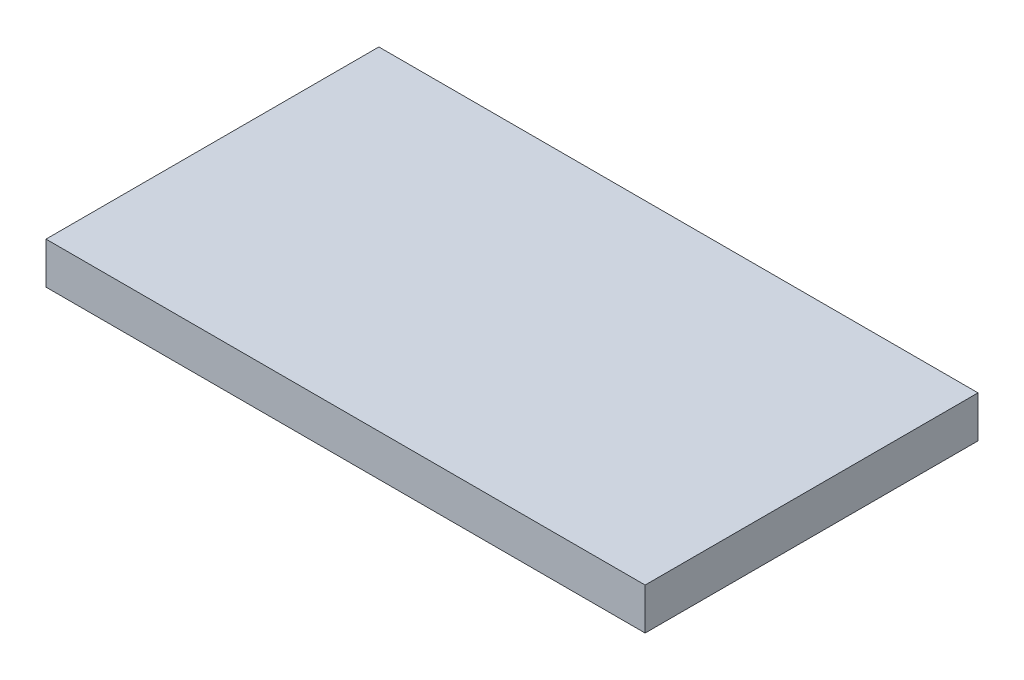
ISO-10303-21;
HEADER;
FILE_DESCRIPTION(('STEP AP214'),'2;1');
FILE_NAME('part.step','',(''),(''),'','','');
FILE_SCHEMA(('AUTOMOTIVE_DESIGN { 1 0 10303 214 1 1 1 1 }'));
ENDSEC;
DATA;
#1=APPLICATION_CONTEXT('core data for automotive mechanical design processes');
#2=APPLICATION_PROTOCOL_DEFINITION('international standard','automotive_design',2000,#1);
#3=PRODUCT_CONTEXT('',#1,'mechanical');
#4=PRODUCT('Part','Part','',(#3));
#5=PRODUCT_RELATED_PRODUCT_CATEGORY('part','',(#4));
#6=PRODUCT_DEFINITION_FORMATION('','',#4);
#7=PRODUCT_DEFINITION_CONTEXT('part definition',#1,'design');
#8=PRODUCT_DEFINITION('design','',#6,#7);
#9=PRODUCT_DEFINITION_SHAPE('','',#8);
#10=(LENGTH_UNIT() NAMED_UNIT(*) SI_UNIT(.MILLI.,.METRE.));
#11=(NAMED_UNIT(*) PLANE_ANGLE_UNIT() SI_UNIT($,.RADIAN.));
#12=(NAMED_UNIT(*) SI_UNIT($,.STERADIAN.) SOLID_ANGLE_UNIT());
#13=UNCERTAINTY_MEASURE_WITH_UNIT(LENGTH_MEASURE(1.E-05),#10,'distance_accuracy_value','');
#14=(GEOMETRIC_REPRESENTATION_CONTEXT(3) GLOBAL_UNCERTAINTY_ASSIGNED_CONTEXT((#13)) GLOBAL_UNIT_ASSIGNED_CONTEXT((#10,
#11,#12)) REPRESENTATION_CONTEXT('',''));
#15=CARTESIAN_POINT('',(0.,0.,0.));
#16=DIRECTION('',(0.,0.,1.));
#17=DIRECTION('',(1.,0.,0.));
#18=AXIS2_PLACEMENT_3D('',#15,#16,#17);
#19=CARTESIAN_POINT('',(-180.,-25.,0.));
#20=DIRECTION('',(-1.,0.,0.));
#21=DIRECTION('',(0.,0.,1.));
#22=AXIS2_PLACEMENT_3D('',#19,#20,#21);
#23=PLANE('',#22);
#24=DIRECTION('',(0.,0.,1.));
#25=VECTOR('',#24,1.);
#26=CARTESIAN_POINT('',(-180.,0.,0.));
#27=LINE('',#26,#25);
#28=CARTESIAN_POINT('',(-180.,0.,-200.));
#29=VERTEX_POINT('',#28);
#30=CARTESIAN_POINT('',(-180.,0.,0.));
#31=VERTEX_POINT('',#30);
#32=EDGE_CURVE('E100',#29,#31,#27,.T.);
#33=ORIENTED_EDGE('',*,*,#32,.F.);
#34=DIRECTION('',(0.,1.,0.));
#35=VECTOR('',#34,1.);
#36=CARTESIAN_POINT('',(-180.,-25.,-200.));
#37=LINE('',#36,#35);
#38=CARTESIAN_POINT('',(-180.,-25.,-200.));
#39=VERTEX_POINT('',#38);
#40=EDGE_CURVE('E11',#39,#29,#37,.T.);
#41=ORIENTED_EDGE('',*,*,#40,.F.);
#42=DIRECTION('',(0.,0.,1.));
#43=VECTOR('',#42,1.);
#44=CARTESIAN_POINT('',(-180.,-25.,0.));
#45=LINE('',#44,#43);
#46=CARTESIAN_POINT('',(-180.,-25.,0.));
#47=VERTEX_POINT('',#46);
#48=EDGE_CURVE('E94',#39,#47,#45,.T.);
#49=ORIENTED_EDGE('',*,*,#48,.T.);
#50=DIRECTION('',(0.,1.,0.));
#51=VECTOR('',#50,1.);
#52=CARTESIAN_POINT('',(-180.,-25.,0.));
#53=LINE('',#52,#51);
#54=EDGE_CURVE('E39',#47,#31,#53,.T.);
#55=ORIENTED_EDGE('',*,*,#54,.T.);
#56=EDGE_LOOP('',(#33,#41,#49,#55));
#57=FACE_BOUND('',#56,.T.);
#58=ADVANCED_FACE('F36',(#57),#23,.T.);
#59=CARTESIAN_POINT('',(-180.,-25.,-200.));
#60=DIRECTION('',(0.,0.,-1.));
#61=DIRECTION('',(-1.,0.,0.));
#62=AXIS2_PLACEMENT_3D('',#59,#60,#61);
#63=PLANE('',#62);
#64=DIRECTION('',(-1.,0.,0.));
#65=VECTOR('',#64,1.);
#66=CARTESIAN_POINT('',(-180.,0.,-200.));
#67=LINE('',#66,#65);
#68=CARTESIAN_POINT('',(180.,0.,-200.));
#69=VERTEX_POINT('',#68);
#70=EDGE_CURVE('E96',#69,#29,#67,.T.);
#71=ORIENTED_EDGE('',*,*,#70,.F.);
#72=DIRECTION('',(0.,1.,0.));
#73=VECTOR('',#72,1.);
#74=CARTESIAN_POINT('',(180.,-25.,-200.));
#75=LINE('',#74,#73);
#76=CARTESIAN_POINT('',(180.,-25.,-200.));
#77=VERTEX_POINT('',#76);
#78=EDGE_CURVE('E45',#77,#69,#75,.T.);
#79=ORIENTED_EDGE('',*,*,#78,.F.);
#80=DIRECTION('',(-1.,0.,0.));
#81=VECTOR('',#80,1.);
#82=CARTESIAN_POINT('',(-180.,-25.,-200.));
#83=LINE('',#82,#81);
#84=EDGE_CURVE('E91',#77,#39,#83,.T.);
#85=ORIENTED_EDGE('',*,*,#84,.T.);
#86=ORIENTED_EDGE('',*,*,#40,.T.);
#87=EDGE_LOOP('',(#71,#79,#85,#86));
#88=FACE_BOUND('',#87,.T.);
#89=ADVANCED_FACE('F110',(#88),#63,.T.);
#90=CARTESIAN_POINT('',(180.,-25.,0.));
#91=DIRECTION('',(1.,0.,0.));
#92=DIRECTION('',(0.,0.,-1.));
#93=AXIS2_PLACEMENT_3D('',#90,#91,#92);
#94=PLANE('',#93);
#95=DIRECTION('',(0.,0.,-1.));
#96=VECTOR('',#95,1.);
#97=CARTESIAN_POINT('',(180.,0.,0.));
#98=LINE('',#97,#96);
#99=CARTESIAN_POINT('',(180.,0.,0.));
#100=VERTEX_POINT('',#99);
#101=EDGE_CURVE('E86',#100,#69,#98,.T.);
#102=ORIENTED_EDGE('',*,*,#101,.F.);
#103=DIRECTION('',(0.,1.,0.));
#104=VECTOR('',#103,1.);
#105=CARTESIAN_POINT('',(180.,-25.,0.));
#106=LINE('',#105,#104);
#107=CARTESIAN_POINT('',(180.,-25.,0.));
#108=VERTEX_POINT('',#107);
#109=EDGE_CURVE('E81',#108,#100,#106,.T.);
#110=ORIENTED_EDGE('',*,*,#109,.F.);
#111=DIRECTION('',(0.,0.,-1.));
#112=VECTOR('',#111,1.);
#113=CARTESIAN_POINT('',(180.,-25.,0.));
#114=LINE('',#113,#112);
#115=EDGE_CURVE('E84',#108,#77,#114,.T.);
#116=ORIENTED_EDGE('',*,*,#115,.T.);
#117=ORIENTED_EDGE('',*,*,#78,.T.);
#118=EDGE_LOOP('',(#102,#110,#116,#117));
#119=FACE_BOUND('',#118,.T.);
#120=ADVANCED_FACE('F83',(#119),#94,.T.);
#121=CARTESIAN_POINT('',(-180.,-25.,0.));
#122=DIRECTION('',(0.,0.,1.));
#123=DIRECTION('',(1.,0.,0.));
#124=AXIS2_PLACEMENT_3D('',#121,#122,#123);
#125=PLANE('',#124);
#126=DIRECTION('',(1.,0.,0.));
#127=VECTOR('',#126,1.);
#128=CARTESIAN_POINT('',(-180.,0.,0.));
#129=LINE('',#128,#127);
#130=EDGE_CURVE('E103',#31,#100,#129,.T.);
#131=ORIENTED_EDGE('',*,*,#130,.F.);
#132=ORIENTED_EDGE('',*,*,#54,.F.);
#133=DIRECTION('',(1.,0.,0.));
#134=VECTOR('',#133,1.);
#135=CARTESIAN_POINT('',(-180.,-25.,0.));
#136=LINE('',#135,#134);
#137=EDGE_CURVE('E90',#47,#108,#136,.T.);
#138=ORIENTED_EDGE('',*,*,#137,.T.);
#139=ORIENTED_EDGE('',*,*,#109,.T.);
#140=EDGE_LOOP('',(#131,#132,#138,#139));
#141=FACE_BOUND('',#140,.T.);
#142=ADVANCED_FACE('F93',(#141),#125,.T.);
#143=CARTESIAN_POINT('',(0.,-25.,0.));
#144=DIRECTION('',(0.,-1.,0.));
#145=DIRECTION('',(0.,0.,-1.));
#146=AXIS2_PLACEMENT_3D('',#143,#144,#145);
#147=PLANE('',#146);
#148=ORIENTED_EDGE('',*,*,#48,.F.);
#149=ORIENTED_EDGE('',*,*,#84,.F.);
#150=ORIENTED_EDGE('',*,*,#115,.F.);
#151=ORIENTED_EDGE('',*,*,#137,.F.);
#152=EDGE_LOOP('',(#148,#149,#150,#151));
#153=FACE_BOUND('',#152,.T.);
#154=ADVANCED_FACE('F89',(#153),#147,.T.);
#155=CARTESIAN_POINT('',(0.,0.,0.));
#156=DIRECTION('',(0.,-1.,0.));
#157=DIRECTION('',(0.,0.,-1.));
#158=AXIS2_PLACEMENT_3D('',#155,#156,#157);
#159=PLANE('',#158);
#160=ORIENTED_EDGE('',*,*,#32,.T.);
#161=ORIENTED_EDGE('',*,*,#130,.T.);
#162=ORIENTED_EDGE('',*,*,#101,.T.);
#163=ORIENTED_EDGE('',*,*,#70,.T.);
#164=EDGE_LOOP('',(#160,#161,#162,#163));
#165=FACE_BOUND('',#164,.T.);
#166=ADVANCED_FACE('F109',(#165),#159,.F.);
#167=CLOSED_SHELL('',(#58,#89,#120,#142,#154,#166));
#168=MANIFOLD_SOLID_BREP('B2',#167);
#169=ADVANCED_BREP_SHAPE_REPRESENTATION('',(#18,#168),#14);
#170=SHAPE_DEFINITION_REPRESENTATION(#9,#169);
ENDSEC;
END-ISO-10303-21;
